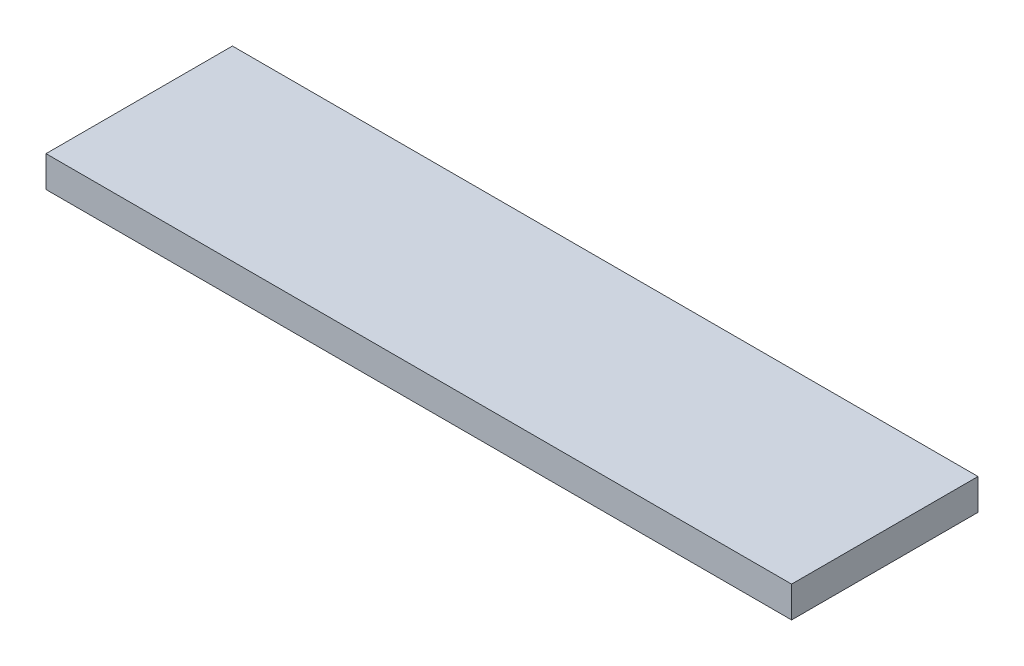
ISO-10303-21;
HEADER;
FILE_DESCRIPTION(('STEP AP214'),'2;1');
FILE_NAME('part.step','',(''),(''),'','','');
FILE_SCHEMA(('AUTOMOTIVE_DESIGN { 1 0 10303 214 1 1 1 1 }'));
ENDSEC;
DATA;
#1=APPLICATION_CONTEXT('core data for automotive mechanical design processes');
#2=APPLICATION_PROTOCOL_DEFINITION('international standard','automotive_design',2000,#1);
#3=PRODUCT_CONTEXT('',#1,'mechanical');
#4=PRODUCT('Part','Part','',(#3));
#5=PRODUCT_RELATED_PRODUCT_CATEGORY('part','',(#4));
#6=PRODUCT_DEFINITION_FORMATION('','',#4);
#7=PRODUCT_DEFINITION_CONTEXT('part definition',#1,'design');
#8=PRODUCT_DEFINITION('design','',#6,#7);
#9=PRODUCT_DEFINITION_SHAPE('','',#8);
#10=(LENGTH_UNIT() NAMED_UNIT(*) SI_UNIT(.MILLI.,.METRE.));
#11=(NAMED_UNIT(*) PLANE_ANGLE_UNIT() SI_UNIT($,.RADIAN.));
#12=(NAMED_UNIT(*) SI_UNIT($,.STERADIAN.) SOLID_ANGLE_UNIT());
#13=UNCERTAINTY_MEASURE_WITH_UNIT(LENGTH_MEASURE(1.E-05),#10,'distance_accuracy_value','');
#14=(GEOMETRIC_REPRESENTATION_CONTEXT(3) GLOBAL_UNCERTAINTY_ASSIGNED_CONTEXT((#13)) GLOBAL_UNIT_ASSIGNED_CONTEXT((#10,
#11,#12)) REPRESENTATION_CONTEXT('',''));
#15=CARTESIAN_POINT('',(0.,0.,0.));
#16=DIRECTION('',(0.,0.,1.));
#17=DIRECTION('',(1.,0.,0.));
#18=AXIS2_PLACEMENT_3D('',#15,#16,#17);
#19=CARTESIAN_POINT('',(180.,15.,45.));
#20=DIRECTION('',(-1.,0.,0.));
#21=DIRECTION('',(0.,0.,1.));
#22=AXIS2_PLACEMENT_3D('',#19,#20,#21);
#23=PLANE('',#22);
#24=DIRECTION('',(0.,0.,-1.));
#25=VECTOR('',#24,1.);
#26=CARTESIAN_POINT('',(180.,0.,45.));
#27=LINE('',#26,#25);
#28=CARTESIAN_POINT('',(180.,0.,45.));
#29=VERTEX_POINT('',#28);
#30=CARTESIAN_POINT('',(180.,0.,-45.));
#31=VERTEX_POINT('',#30);
#32=EDGE_CURVE('E96',#29,#31,#27,.T.);
#33=ORIENTED_EDGE('',*,*,#32,.T.);
#34=DIRECTION('',(0.,-1.,0.));
#35=VECTOR('',#34,1.);
#36=CARTESIAN_POINT('',(180.,15.,-45.));
#37=LINE('',#36,#35);
#38=CARTESIAN_POINT('',(180.,15.,-45.));
#39=VERTEX_POINT('',#38);
#40=EDGE_CURVE('E11',#39,#31,#37,.T.);
#41=ORIENTED_EDGE('',*,*,#40,.F.);
#42=DIRECTION('',(0.,0.,-1.));
#43=VECTOR('',#42,1.);
#44=CARTESIAN_POINT('',(180.,15.,45.));
#45=LINE('',#44,#43);
#46=CARTESIAN_POINT('',(180.,15.,45.));
#47=VERTEX_POINT('',#46);
#48=EDGE_CURVE('E84',#47,#39,#45,.T.);
#49=ORIENTED_EDGE('',*,*,#48,.F.);
#50=DIRECTION('',(0.,-1.,0.));
#51=VECTOR('',#50,1.);
#52=CARTESIAN_POINT('',(180.,15.,45.));
#53=LINE('',#52,#51);
#54=EDGE_CURVE('E92',#47,#29,#53,.T.);
#55=ORIENTED_EDGE('',*,*,#54,.T.);
#56=EDGE_LOOP('',(#33,#41,#49,#55));
#57=FACE_BOUND('',#56,.T.);
#58=ADVANCED_FACE('F33',(#57),#23,.F.);
#59=CARTESIAN_POINT('',(-180.,15.,-45.));
#60=DIRECTION('',(0.,0.,1.));
#61=DIRECTION('',(1.,0.,0.));
#62=AXIS2_PLACEMENT_3D('',#59,#60,#61);
#63=PLANE('',#62);
#64=DIRECTION('',(-1.,0.,0.));
#65=VECTOR('',#64,1.);
#66=CARTESIAN_POINT('',(-180.,0.,-45.));
#67=LINE('',#66,#65);
#68=CARTESIAN_POINT('',(-180.,0.,-45.));
#69=VERTEX_POINT('',#68);
#70=EDGE_CURVE('E88',#31,#69,#67,.T.);
#71=ORIENTED_EDGE('',*,*,#70,.T.);
#72=DIRECTION('',(0.,-1.,0.));
#73=VECTOR('',#72,1.);
#74=CARTESIAN_POINT('',(-180.,15.,-45.));
#75=LINE('',#74,#73);
#76=CARTESIAN_POINT('',(-180.,15.,-45.));
#77=VERTEX_POINT('',#76);
#78=EDGE_CURVE('E41',#77,#69,#75,.T.);
#79=ORIENTED_EDGE('',*,*,#78,.F.);
#80=DIRECTION('',(-1.,0.,0.));
#81=VECTOR('',#80,1.);
#82=CARTESIAN_POINT('',(-180.,15.,-45.));
#83=LINE('',#82,#81);
#84=EDGE_CURVE('E79',#39,#77,#83,.T.);
#85=ORIENTED_EDGE('',*,*,#84,.F.);
#86=ORIENTED_EDGE('',*,*,#40,.T.);
#87=EDGE_LOOP('',(#71,#79,#85,#86));
#88=FACE_BOUND('',#87,.T.);
#89=ADVANCED_FACE('F87',(#88),#63,.F.);
#90=CARTESIAN_POINT('',(-180.,15.,45.));
#91=DIRECTION('',(1.,0.,0.));
#92=DIRECTION('',(0.,0.,-1.));
#93=AXIS2_PLACEMENT_3D('',#90,#91,#92);
#94=PLANE('',#93);
#95=DIRECTION('',(0.,0.,1.));
#96=VECTOR('',#95,1.);
#97=CARTESIAN_POINT('',(-180.,0.,45.));
#98=LINE('',#97,#96);
#99=CARTESIAN_POINT('',(-180.,0.,45.));
#100=VERTEX_POINT('',#99);
#101=EDGE_CURVE('E66',#69,#100,#98,.T.);
#102=ORIENTED_EDGE('',*,*,#101,.T.);
#103=DIRECTION('',(0.,-1.,0.));
#104=VECTOR('',#103,1.);
#105=CARTESIAN_POINT('',(-180.,15.,45.));
#106=LINE('',#105,#104);
#107=CARTESIAN_POINT('',(-180.,15.,45.));
#108=VERTEX_POINT('',#107);
#109=EDGE_CURVE('E89',#108,#100,#106,.T.);
#110=ORIENTED_EDGE('',*,*,#109,.F.);
#111=DIRECTION('',(0.,0.,1.));
#112=VECTOR('',#111,1.);
#113=CARTESIAN_POINT('',(-180.,15.,45.));
#114=LINE('',#113,#112);
#115=EDGE_CURVE('E82',#77,#108,#114,.T.);
#116=ORIENTED_EDGE('',*,*,#115,.F.);
#117=ORIENTED_EDGE('',*,*,#78,.T.);
#118=EDGE_LOOP('',(#102,#110,#116,#117));
#119=FACE_BOUND('',#118,.T.);
#120=ADVANCED_FACE('F90',(#119),#94,.F.);
#121=CARTESIAN_POINT('',(-180.,15.,45.));
#122=DIRECTION('',(0.,0.,-1.));
#123=DIRECTION('',(-1.,0.,0.));
#124=AXIS2_PLACEMENT_3D('',#121,#122,#123);
#125=PLANE('',#124);
#126=DIRECTION('',(1.,0.,0.));
#127=VECTOR('',#126,1.);
#128=CARTESIAN_POINT('',(-180.,0.,45.));
#129=LINE('',#128,#127);
#130=EDGE_CURVE('E72',#100,#29,#129,.T.);
#131=ORIENTED_EDGE('',*,*,#130,.T.);
#132=ORIENTED_EDGE('',*,*,#54,.F.);
#133=DIRECTION('',(1.,0.,0.));
#134=VECTOR('',#133,1.);
#135=CARTESIAN_POINT('',(-180.,15.,45.));
#136=LINE('',#135,#134);
#137=EDGE_CURVE('E49',#108,#47,#136,.T.);
#138=ORIENTED_EDGE('',*,*,#137,.F.);
#139=ORIENTED_EDGE('',*,*,#109,.T.);
#140=EDGE_LOOP('',(#131,#132,#138,#139));
#141=FACE_BOUND('',#140,.T.);
#142=ADVANCED_FACE('F103',(#141),#125,.F.);
#143=CARTESIAN_POINT('',(0.,15.,0.));
#144=DIRECTION('',(0.,-1.,0.));
#145=DIRECTION('',(0.,0.,-1.));
#146=AXIS2_PLACEMENT_3D('',#143,#144,#145);
#147=PLANE('',#146);
#148=ORIENTED_EDGE('',*,*,#48,.T.);
#149=ORIENTED_EDGE('',*,*,#84,.T.);
#150=ORIENTED_EDGE('',*,*,#115,.T.);
#151=ORIENTED_EDGE('',*,*,#137,.T.);
#152=EDGE_LOOP('',(#148,#149,#150,#151));
#153=FACE_BOUND('',#152,.T.);
#154=ADVANCED_FACE('F80',(#153),#147,.F.);
#155=CARTESIAN_POINT('',(0.,0.,0.));
#156=DIRECTION('',(0.,-1.,0.));
#157=DIRECTION('',(0.,0.,-1.));
#158=AXIS2_PLACEMENT_3D('',#155,#156,#157);
#159=PLANE('',#158);
#160=ORIENTED_EDGE('',*,*,#32,.F.);
#161=ORIENTED_EDGE('',*,*,#130,.F.);
#162=ORIENTED_EDGE('',*,*,#101,.F.);
#163=ORIENTED_EDGE('',*,*,#70,.F.);
#164=EDGE_LOOP('',(#160,#161,#162,#163));
#165=FACE_BOUND('',#164,.T.);
#166=ADVANCED_FACE('F106',(#165),#159,.T.);
#167=CLOSED_SHELL('',(#58,#89,#120,#142,#154,#166));
#168=MANIFOLD_SOLID_BREP('B2',#167);
#169=ADVANCED_BREP_SHAPE_REPRESENTATION('',(#18,#168),#14);
#170=SHAPE_DEFINITION_REPRESENTATION(#9,#169);
ENDSEC;
END-ISO-10303-21;
